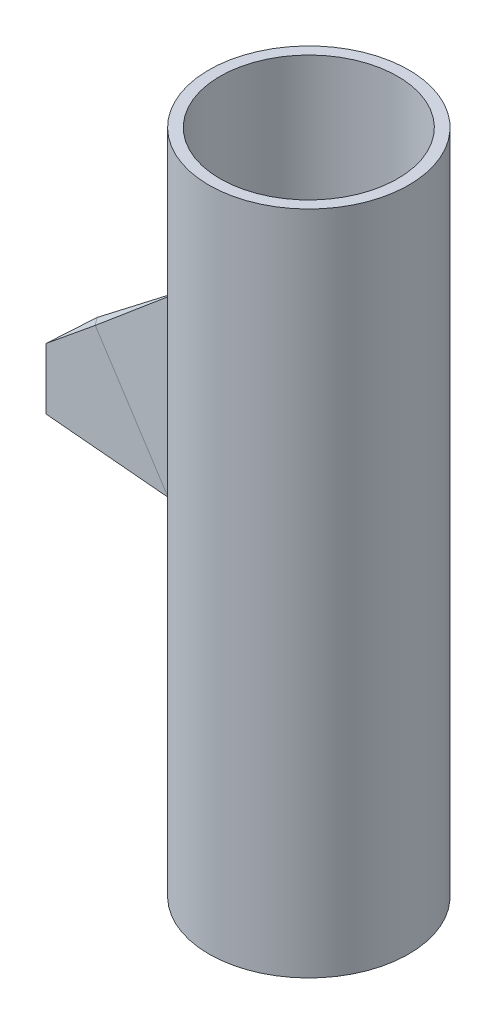
ISO-10303-21;
HEADER;
FILE_DESCRIPTION(('STEP AP214'),'2;1');
FILE_NAME('part.step','',(''),(''),'','','');
FILE_SCHEMA(('AUTOMOTIVE_DESIGN { 1 0 10303 214 1 1 1 1 }'));
ENDSEC;
DATA;
#1=APPLICATION_CONTEXT('core data for automotive mechanical design processes');
#2=APPLICATION_PROTOCOL_DEFINITION('international standard','automotive_design',2000,#1);
#3=PRODUCT_CONTEXT('',#1,'mechanical');
#4=PRODUCT('Part','Part','',(#3));
#5=PRODUCT_RELATED_PRODUCT_CATEGORY('part','',(#4));
#6=PRODUCT_DEFINITION_FORMATION('','',#4);
#7=PRODUCT_DEFINITION_CONTEXT('part definition',#1,'design');
#8=PRODUCT_DEFINITION('design','',#6,#7);
#9=PRODUCT_DEFINITION_SHAPE('','',#8);
#10=(LENGTH_UNIT() NAMED_UNIT(*) SI_UNIT(.MILLI.,.METRE.));
#11=(NAMED_UNIT(*) PLANE_ANGLE_UNIT() SI_UNIT($,.RADIAN.));
#12=(NAMED_UNIT(*) SI_UNIT($,.STERADIAN.) SOLID_ANGLE_UNIT());
#13=UNCERTAINTY_MEASURE_WITH_UNIT(LENGTH_MEASURE(1.E-05),#10,'distance_accuracy_value','');
#14=(GEOMETRIC_REPRESENTATION_CONTEXT(3) GLOBAL_UNCERTAINTY_ASSIGNED_CONTEXT((#13)) GLOBAL_UNIT_ASSIGNED_CONTEXT((#10,
#11,#12)) REPRESENTATION_CONTEXT('',''));
#15=CARTESIAN_POINT('',(0.,0.,0.));
#16=DIRECTION('',(0.,0.,1.));
#17=DIRECTION('',(1.,0.,0.));
#18=AXIS2_PLACEMENT_3D('',#15,#16,#17);
#19=CARTESIAN_POINT('',(-118.389869673722,159.01017756827,5.));
#20=DIRECTION('',(0.64018439966448,-0.768221279597376,0.));
#21=DIRECTION('',(0.768221279597376,0.64018439966448,0.));
#22=AXIS2_PLACEMENT_3D('',#19,#20,#21);
#23=PLANE('',#22);
#24=DIRECTION('',(0.767607085732421,0.639672571443684,-0.0399795357152303));
#25=VECTOR('',#24,1.);
#26=CARTESIAN_POINT('',(-58.4484196318922,208.961385936461,-1.90482530579749));
#27=LINE('',#26,#25);
#28=CARTESIAN_POINT('',(-95.3693632338271,178.193932934849,0.0181405068032898));
#29=VERTEX_POINT('',#28);
#30=CARTESIAN_POINT('',(-95.0210655032028,178.484181043703,0.));
#31=VERTEX_POINT('',#30);
#32=EDGE_CURVE('E171',#29,#31,#27,.T.);
#33=ORIENTED_EDGE('',*,*,#32,.T.);
#34=DIRECTION('',(-0.767607085732421,-0.639672571443684,-0.0399795357152303));
#35=VECTOR('',#34,1.);
#36=CARTESIAN_POINT('',(-95.3714965549691,178.192155167231,-0.0182516172794495));
#37=LINE('',#36,#35);
#38=CARTESIAN_POINT('',(-95.3693632338269,178.193932934849,-0.0181405068032945));
#39=VERTEX_POINT('',#38);
#40=EDGE_CURVE('E174',#31,#39,#37,.T.);
#41=ORIENTED_EDGE('',*,*,#40,.T.);
#42=DIRECTION('',(-0.766651877999928,-0.63887656499994,0.063887656499994));
#43=VECTOR('',#42,1.);
#44=CARTESIAN_POINT('',(-118.296796937566,159.087738181733,1.8924789685083));
#45=LINE('',#44,#43);
#46=CARTESIAN_POINT('',(-95.5870493154665,178.012527866816,0.));
#47=VERTEX_POINT('',#46);
#48=EDGE_CURVE('E161',#39,#47,#45,.T.);
#49=ORIENTED_EDGE('',*,*,#48,.T.);
#50=DIRECTION('',(0.766651877999928,0.63887656499994,0.063887656499994));
#51=VECTOR('',#50,1.);
#52=CARTESIAN_POINT('',(-95.2198738606429,178.318507412503,0.0305979545686391));
#53=LINE('',#52,#51);
#54=EDGE_CURVE('E165',#47,#29,#53,.T.);
#55=ORIENTED_EDGE('',*,*,#54,.T.);
#56=EDGE_LOOP('',(#33,#41,#49,#55));
#57=FACE_BOUND('',#56,.T.);
#58=ADVANCED_FACE('F60',(#57),#23,.F.);
#59=CARTESIAN_POINT('',(-58.3898696737222,129.01017756827,5.));
#60=DIRECTION('',(0.,1.,0.));
#61=DIRECTION('',(0.,0.,1.));
#62=AXIS2_PLACEMENT_3D('',#59,#60,#61);
#63=PLANE('',#62);
#64=DIRECTION('',(0.99654575824488,0.,-0.08304547985374));
#65=VECTOR('',#64,1.);
#66=CARTESIAN_POINT('',(-118.389869673722,129.01017756827,0.));
#67=LINE('',#66,#65);
#68=CARTESIAN_POINT('',(-118.389869673722,129.01017756827,0.));
#69=VERTEX_POINT('',#68);
#70=CARTESIAN_POINT('',(-58.3898696737222,129.01017756827,-5.));
#71=VERTEX_POINT('',#70);
#72=EDGE_CURVE('E130',#69,#71,#67,.T.);
#73=ORIENTED_EDGE('',*,*,#72,.T.);
#74=DIRECTION('',(0.,0.,-1.));
#75=VECTOR('',#74,1.);
#76=CARTESIAN_POINT('',(-58.3898696737222,129.01017756827,5.));
#77=LINE('',#76,#75);
#78=CARTESIAN_POINT('',(-58.3898696737222,129.01017756827,5.));
#79=VERTEX_POINT('',#78);
#80=EDGE_CURVE('E146',#79,#71,#77,.T.);
#81=ORIENTED_EDGE('',*,*,#80,.F.);
#82=DIRECTION('',(-0.99654575824488,0.,-0.08304547985374));
#83=VECTOR('',#82,1.);
#84=CARTESIAN_POINT('',(-58.3898696737222,129.01017756827,5.));
#85=LINE('',#84,#83);
#86=EDGE_CURVE('E139',#79,#69,#85,.T.);
#87=ORIENTED_EDGE('',*,*,#86,.T.);
#88=EDGE_LOOP('',(#73,#81,#87));
#89=FACE_BOUND('',#88,.T.);
#90=ADVANCED_FACE('F144',(#89),#63,.F.);
#91=CARTESIAN_POINT('',(-58.3898696737222,209.01017756827,5.));
#92=DIRECTION('',(-1.,0.,0.));
#93=DIRECTION('',(0.,-1.,0.));
#94=AXIS2_PLACEMENT_3D('',#91,#92,#93);
#95=PLANE('',#94);
#96=CARTESIAN_POINT('',(-58.3898696737222,162.229328701854,0.));
#97=DIRECTION('',(1.,0.,0.));
#98=DIRECTION('',(0.,1.,0.));
#99=AXIS2_PLACEMENT_3D('',#96,#97,#98);
#100=CIRCLE('',#99,2.);
#101=CARTESIAN_POINT('',(-58.3898696737222,164.229328701854,0.));
#102=VERTEX_POINT('',#101);
#103=EDGE_CURVE('E217',#102,#102,#100,.T.);
#104=ORIENTED_EDGE('',*,*,#103,.F.);
#105=EDGE_LOOP('',(#104));
#106=FACE_BOUND('',#105,.T.);
#107=DIRECTION('',(0.,0.998052578482889,0.0623782861551805));
#108=VECTOR('',#107,1.);
#109=CARTESIAN_POINT('',(-58.3898696737222,209.01017756827,0.));
#110=LINE('',#109,#108);
#111=CARTESIAN_POINT('',(-58.3898696737222,206.531517581945,-0.154916249145324));
#112=VERTEX_POINT('',#111);
#113=EDGE_CURVE('E152',#71,#112,#110,.T.);
#114=ORIENTED_EDGE('',*,*,#113,.T.);
#115=DIRECTION('',(0.,0.768641882328392,0.639679338989987));
#116=VECTOR('',#115,1.);
#117=CARTESIAN_POINT('',(-58.3898696737222,178.031969088937,-23.8728176030186));
#118=LINE('',#117,#116);
#119=CARTESIAN_POINT('',(-58.3898696737222,206.717665719126,0.));
#120=VERTEX_POINT('',#119);
#121=EDGE_CURVE('E188',#112,#120,#118,.T.);
#122=ORIENTED_EDGE('',*,*,#121,.T.);
#123=DIRECTION('',(0.,-0.76864188232839,0.639679338989989));
#124=VECTOR('',#123,1.);
#125=CARTESIAN_POINT('',(-58.3898696737222,177.873017458231,24.0051003687634));
#126=LINE('',#125,#124);
#127=CARTESIAN_POINT('',(-58.3898696737222,206.531517581945,0.154916249145326));
#128=VERTEX_POINT('',#127);
#129=EDGE_CURVE('E185',#120,#128,#126,.T.);
#130=ORIENTED_EDGE('',*,*,#129,.T.);
#131=DIRECTION('',(0.,-0.998052578482889,0.0623782861551805));
#132=VECTOR('',#131,1.);
#133=CARTESIAN_POINT('',(-58.3898696737222,129.01017756827,5.));
#134=LINE('',#133,#132);
#135=EDGE_CURVE('E157',#128,#79,#134,.T.);
#136=ORIENTED_EDGE('',*,*,#135,.T.);
#137=ORIENTED_EDGE('',*,*,#80,.T.);
#138=EDGE_LOOP('',(#114,#122,#130,#136,#137));
#139=FACE_BOUND('',#138,.T.);
#140=ADVANCED_FACE('F159',(#106,#139),#95,.F.);
#141=CARTESIAN_POINT('',(-118.390869673722,209.01017756827,0.));
#142=DIRECTION('',(0.,0.0623782861551805,-0.998052578482889));
#143=DIRECTION('',(0.,0.998052578482889,0.0623782861551805));
#144=AXIS2_PLACEMENT_3D('',#141,#142,#143);
#145=PLANE('',#144);
#146=DIRECTION('',(0.599251403326707,-0.799001871102276,-0.0499376169438922));
#147=VECTOR('',#146,1.);
#148=CARTESIAN_POINT('',(-161.956547745772,267.099081664337,3.63055650600419));
#149=LINE('',#148,#147);
#150=CARTESIAN_POINT('',(-94.1689496800336,176.715617576685,-2.01840999947405));
#151=VERTEX_POINT('',#150);
#152=EDGE_CURVE('E126',#151,#71,#149,.T.);
#153=ORIENTED_EDGE('',*,*,#152,.F.);
#154=DIRECTION('',(0.767607085732421,0.639672571443684,0.0399795357152303));
#155=VECTOR('',#154,1.);
#156=CARTESIAN_POINT('',(-57.1680508325632,207.549699949577,-0.0912798511682949));
#157=LINE('',#156,#155);
#158=EDGE_CURVE('E154',#151,#112,#157,.T.);
#159=ORIENTED_EDGE('',*,*,#158,.T.);
#160=ORIENTED_EDGE('',*,*,#113,.F.);
#161=EDGE_LOOP('',(#153,#159,#160));
#162=FACE_BOUND('',#161,.T.);
#163=ADVANCED_FACE('F153',(#162),#145,.T.);
#164=CARTESIAN_POINT('',(-118.390869673722,129.01017756827,5.));
#165=DIRECTION('',(0.,0.0623782861551805,0.998052578482889));
#166=DIRECTION('',(0.,-0.998052578482889,0.0623782861551805));
#167=AXIS2_PLACEMENT_3D('',#164,#165,#166);
#168=PLANE('',#167);
#169=ORIENTED_EDGE('',*,*,#135,.F.);
#170=DIRECTION('',(-0.767607085732421,-0.639672571443684,0.0399795357152303));
#171=VECTOR('',#170,1.);
#172=CARTESIAN_POINT('',(-94.0911277556401,176.780469180346,2.01435677424522));
#173=LINE('',#172,#171);
#174=CARTESIAN_POINT('',(-94.1689496800336,176.715617576685,2.01840999947405));
#175=VERTEX_POINT('',#174);
#176=EDGE_CURVE('E85',#128,#175,#173,.T.);
#177=ORIENTED_EDGE('',*,*,#176,.T.);
#178=DIRECTION('',(-0.599251403326707,0.799001871102276,-0.0499376169438922));
#179=VECTOR('',#178,1.);
#180=CARTESIAN_POINT('',(-140.260787147269,238.171400866332,-1.82257645612888));
#181=LINE('',#180,#179);
#182=EDGE_CURVE('E140',#79,#175,#181,.T.);
#183=ORIENTED_EDGE('',*,*,#182,.F.);
#184=EDGE_LOOP('',(#169,#177,#183));
#185=FACE_BOUND('',#184,.T.);
#186=ADVANCED_FACE('F268',(#185),#168,.T.);
#187=CARTESIAN_POINT('',(-118.389869673722,300.001,0.));
#188=DIRECTION('',(-0.08304547985374,0.,-0.99654575824488));
#189=DIRECTION('',(-0.99654575824488,0.,0.08304547985374));
#190=AXIS2_PLACEMENT_3D('',#187,#188,#189);
#191=PLANE('',#190);
#192=DIRECTION('',(0.766651877999928,0.63887656499994,-0.063887656499994));
#193=VECTOR('',#192,1.);
#194=CARTESIAN_POINT('',(-94.1055960210215,176.782064853308,-2.02368947105839));
#195=LINE('',#194,#193);
#196=CARTESIAN_POINT('',(-118.389869673722,156.545170142724,0.));
#197=VERTEX_POINT('',#196);
#198=CARTESIAN_POINT('',(-94.252853218763,176.659350521856,-2.01141803791326));
#199=VERTEX_POINT('',#198);
#200=EDGE_CURVE('E178',#197,#199,#195,.T.);
#201=ORIENTED_EDGE('',*,*,#200,.T.);
#202=DIRECTION('',(0.828551245129587,0.555639714891766,-0.0690459370941323));
#203=VECTOR('',#202,1.);
#204=CARTESIAN_POINT('',(-54.154383545227,203.550025525929,-5.3529571773746));
#205=LINE('',#204,#203);
#206=EDGE_CURVE('E133',#199,#151,#205,.T.);
#207=ORIENTED_EDGE('',*,*,#206,.T.);
#208=ORIENTED_EDGE('',*,*,#152,.T.);
#209=ORIENTED_EDGE('',*,*,#72,.F.);
#210=DIRECTION('',(0.,-1.,0.));
#211=VECTOR('',#210,1.);
#212=CARTESIAN_POINT('',(-118.389869673722,300.001,0.));
#213=LINE('',#212,#211);
#214=EDGE_CURVE('E149',#197,#69,#213,.T.);
#215=ORIENTED_EDGE('',*,*,#214,.F.);
#216=EDGE_LOOP('',(#201,#207,#208,#209,#215));
#217=FACE_BOUND('',#216,.T.);
#218=ADVANCED_FACE('F128',(#217),#191,.T.);
#219=CARTESIAN_POINT('',(-58.3898696737222,300.001,5.));
#220=DIRECTION('',(-0.08304547985374,0.,0.99654575824488));
#221=DIRECTION('',(0.99654575824488,0.,0.08304547985374));
#222=AXIS2_PLACEMENT_3D('',#219,#220,#221);
#223=PLANE('',#222);
#224=ORIENTED_EDGE('',*,*,#182,.T.);
#225=DIRECTION('',(-0.828551245129587,-0.555639714891767,-0.0690459370941323));
#226=VECTOR('',#225,1.);
#227=CARTESIAN_POINT('',(-12.6785131111272,231.364407506958,8.80927971354958));
#228=LINE('',#227,#226);
#229=CARTESIAN_POINT('',(-94.252853218763,176.659350521856,2.01141803791326));
#230=VERTEX_POINT('',#229);
#231=EDGE_CURVE('E14',#175,#230,#228,.T.);
#232=ORIENTED_EDGE('',*,*,#231,.T.);
#233=DIRECTION('',(-0.766651877999928,-0.63887656499994,-0.063887656499994));
#234=VECTOR('',#233,1.);
#235=CARTESIAN_POINT('',(-117.182519097945,157.551295622539,0.100612547981467));
#236=LINE('',#235,#234);
#237=EDGE_CURVE('E71',#230,#197,#236,.T.);
#238=ORIENTED_EDGE('',*,*,#237,.T.);
#239=ORIENTED_EDGE('',*,*,#214,.T.);
#240=ORIENTED_EDGE('',*,*,#86,.F.);
#241=EDGE_LOOP('',(#224,#232,#238,#239,#240));
#242=FACE_BOUND('',#241,.T.);
#243=ADVANCED_FACE('F223',(#242),#223,.T.);
#244=CARTESIAN_POINT('',(-118.051898978382,159.291819814386,-1.87207080524299));
#245=DIRECTION('',(-0.49832568573028,0.529326023149063,0.686647997272725));
#246=DIRECTION('',(-0.766651877999928,-0.63887656499994,-0.063887656499994));
#247=AXIS2_PLACEMENT_3D('',#244,#245,#246);
#248=PLANE('',#247);
#249=DIRECTION('',(0.728106286505149,0.685464248193647,0.));
#250=VECTOR('',#249,1.);
#251=CARTESIAN_POINT('',(-117.30324099239,157.56815967862,0.));
#252=LINE('',#251,#250);
#253=EDGE_CURVE('E202',#197,#47,#252,.T.);
#254=ORIENTED_EDGE('',*,*,#253,.F.);
#255=ORIENTED_EDGE('',*,*,#237,.F.);
#256=DIRECTION('',(-0.405676734755801,0.55758065231573,-0.724244574050118));
#257=VECTOR('',#256,1.);
#258=CARTESIAN_POINT('',(-95.3820608180749,178.211385075189,-0.00452817421066039));
#259=LINE('',#258,#257);
#260=EDGE_CURVE('E65',#29,#230,#259,.F.);
#261=ORIENTED_EDGE('',*,*,#260,.F.);
#262=ORIENTED_EDGE('',*,*,#54,.F.);
#263=EDGE_LOOP('',(#254,#255,#261,#262));
#264=FACE_BOUND('',#263,.T.);
#265=ADVANCED_FACE('F63',(#264),#248,.T.);
#266=CARTESIAN_POINT('',(-118.505960709828,158.913435038181,1.22317162534503));
#267=DIRECTION('',(-0.442207349929334,0.573736618724845,0.689404780954308));
#268=DIRECTION('',(-0.767607085732421,-0.639672571443684,0.0399795357152302));
#269=AXIS2_PLACEMENT_3D('',#266,#267,#268);
#270=PLANE('',#269);
#271=ORIENTED_EDGE('',*,*,#176,.F.);
#272=ORIENTED_EDGE('',*,*,#129,.F.);
#273=DIRECTION('',(-0.792042210114094,-0.610466327816351,0.));
#274=VECTOR('',#273,1.);
#275=CARTESIAN_POINT('',(-119.216616273136,159.835466569397,0.));
#276=LINE('',#275,#274);
#277=EDGE_CURVE('E198',#31,#120,#276,.F.);
#278=ORIENTED_EDGE('',*,*,#277,.F.);
#279=ORIENTED_EDGE('',*,*,#32,.F.);
#280=ORIENTED_EDGE('',*,*,#260,.T.);
#281=ORIENTED_EDGE('',*,*,#231,.F.);
#282=EDGE_LOOP('',(#271,#272,#278,#279,#280,#281));
#283=FACE_BOUND('',#282,.T.);
#284=ADVANCED_FACE('F233',(#283),#270,.T.);
#285=CARTESIAN_POINT('',(-118.54169489675,158.88365654908,1.9128871317736));
#286=DIRECTION('',(-0.498325685730282,0.529326023149066,-0.686647997272721));
#287=DIRECTION('',(0.766651877999928,0.63887656499994,-0.063887656499994));
#288=AXIS2_PLACEMENT_3D('',#285,#286,#287);
#289=PLANE('',#288);
#290=ORIENTED_EDGE('',*,*,#253,.T.);
#291=ORIENTED_EDGE('',*,*,#48,.F.);
#292=DIRECTION('',(0.4056767347557,-0.557580652315809,-0.724244574050114));
#293=VECTOR('',#292,1.);
#294=CARTESIAN_POINT('',(-95.3823350036847,178.211761928428,0.00501767095370336));
#295=LINE('',#294,#293);
#296=EDGE_CURVE('E195',#199,#39,#295,.F.);
#297=ORIENTED_EDGE('',*,*,#296,.F.);
#298=ORIENTED_EDGE('',*,*,#200,.F.);
#299=EDGE_LOOP('',(#290,#291,#297,#298));
#300=FACE_BOUND('',#299,.T.);
#301=ADVANCED_FACE('F227',(#300),#289,.T.);
#302=CARTESIAN_POINT('',(-118.199074960835,159.169173162342,-1.20718799258498));
#303=DIRECTION('',(-0.442207349929332,0.573736618724843,-0.689404780954311));
#304=DIRECTION('',(0.767607085732421,0.639672571443684,0.0399795357152302));
#305=AXIS2_PLACEMENT_3D('',#302,#303,#304);
#306=PLANE('',#305);
#307=ORIENTED_EDGE('',*,*,#121,.F.);
#308=ORIENTED_EDGE('',*,*,#158,.F.);
#309=ORIENTED_EDGE('',*,*,#206,.F.);
#310=ORIENTED_EDGE('',*,*,#296,.T.);
#311=ORIENTED_EDGE('',*,*,#40,.F.);
#312=ORIENTED_EDGE('',*,*,#277,.T.);
#313=EDGE_LOOP('',(#307,#308,#309,#310,#311,#312));
#314=FACE_BOUND('',#313,.T.);
#315=ADVANCED_FACE('F230',(#314),#306,.T.);
#316=CARTESIAN_POINT('',(-68.3898696737222,162.229328701854,0.));
#317=DIRECTION('',(1.,0.,0.));
#318=DIRECTION('',(0.,1.,0.));
#319=AXIS2_PLACEMENT_3D('',#316,#317,#318);
#320=CYLINDRICAL_SURFACE('',#319,2.);
#321=CARTESIAN_POINT('',(-68.3898696737222,162.229328701854,0.));
#322=DIRECTION('',(1.,0.,0.));
#323=DIRECTION('',(0.,1.,0.));
#324=AXIS2_PLACEMENT_3D('',#321,#322,#323);
#325=CIRCLE('',#324,2.);
#326=CARTESIAN_POINT('',(-68.3898696737222,164.229328701854,0.));
#327=VERTEX_POINT('',#326);
#328=EDGE_CURVE('E199',#327,#327,#325,.T.);
#329=ORIENTED_EDGE('',*,*,#328,.F.);
#330=EDGE_LOOP('',(#329));
#331=FACE_BOUND('',#330,.T.);
#332=ORIENTED_EDGE('',*,*,#103,.T.);
#333=EDGE_LOOP('',(#332));
#334=FACE_BOUND('',#333,.T.);
#335=ADVANCED_FACE('F250',(#331,#334),#320,.F.);
#336=CARTESIAN_POINT('',(-68.3898696737222,162.229328701854,0.));
#337=DIRECTION('',(1.,0.,0.));
#338=DIRECTION('',(0.,1.,0.));
#339=AXIS2_PLACEMENT_3D('',#336,#337,#338);
#340=PLANE('',#339);
#341=ORIENTED_EDGE('',*,*,#328,.T.);
#342=EDGE_LOOP('',(#341));
#343=FACE_BOUND('',#342,.T.);
#344=ADVANCED_FACE('F287',(#343),#340,.T.);
#345=CLOSED_SHELL('',(#58,#90,#140,#163,#186,#218,#243,#265,#284,#301,#315,#335,#344));
#346=MANIFOLD_SOLID_BREP('B2',#345);
#347=CARTESIAN_POINT('',(0.,300.,0.));
#348=DIRECTION('',(0.,1.,0.));
#349=DIRECTION('',(0.,0.,1.));
#350=AXIS2_PLACEMENT_3D('',#347,#348,#349);
#351=PLANE('',#350);
#352=CARTESIAN_POINT('',(0.,300.,0.));
#353=DIRECTION('',(0.,1.,0.));
#354=DIRECTION('',(0.,0.,1.));
#355=AXIS2_PLACEMENT_3D('',#352,#353,#354);
#356=CIRCLE('',#355,45.);
#357=CARTESIAN_POINT('',(0.,300.,45.));
#358=VERTEX_POINT('',#357);
#359=EDGE_CURVE('E59',#358,#358,#356,.T.);
#360=ORIENTED_EDGE('',*,*,#359,.T.);
#361=EDGE_LOOP('',(#360));
#362=FACE_BOUND('',#361,.T.);
#363=CARTESIAN_POINT('',(0.,300.,0.));
#364=DIRECTION('',(0.,1.,0.));
#365=DIRECTION('',(0.,0.,1.));
#366=AXIS2_PLACEMENT_3D('',#363,#364,#365);
#367=CIRCLE('',#366,40.);
#368=CARTESIAN_POINT('',(0.,300.,40.));
#369=VERTEX_POINT('',#368);
#370=EDGE_CURVE('E374',#369,#369,#367,.T.);
#371=ORIENTED_EDGE('',*,*,#370,.F.);
#372=EDGE_LOOP('',(#371));
#373=FACE_BOUND('',#372,.T.);
#374=ADVANCED_FACE('F363',(#362,#373),#351,.T.);
#375=CARTESIAN_POINT('',(0.,0.,0.));
#376=DIRECTION('',(0.,1.,0.));
#377=DIRECTION('',(0.,0.,1.));
#378=AXIS2_PLACEMENT_3D('',#375,#376,#377);
#379=PLANE('',#378);
#380=CARTESIAN_POINT('',(0.,0.,0.));
#381=DIRECTION('',(0.,1.,0.));
#382=DIRECTION('',(0.,0.,1.));
#383=AXIS2_PLACEMENT_3D('',#380,#381,#382);
#384=CIRCLE('',#383,45.);
#385=CARTESIAN_POINT('',(0.,0.,45.));
#386=VERTEX_POINT('',#385);
#387=EDGE_CURVE('E367',#386,#386,#384,.T.);
#388=ORIENTED_EDGE('',*,*,#387,.F.);
#389=EDGE_LOOP('',(#388));
#390=FACE_BOUND('',#389,.T.);
#391=CARTESIAN_POINT('',(0.,0.,0.));
#392=DIRECTION('',(0.,1.,0.));
#393=DIRECTION('',(0.,0.,1.));
#394=AXIS2_PLACEMENT_3D('',#391,#392,#393);
#395=CIRCLE('',#394,40.);
#396=CARTESIAN_POINT('',(0.,0.,40.));
#397=VERTEX_POINT('',#396);
#398=EDGE_CURVE('E376',#397,#397,#395,.T.);
#399=ORIENTED_EDGE('',*,*,#398,.T.);
#400=EDGE_LOOP('',(#399));
#401=FACE_BOUND('',#400,.T.);
#402=ADVANCED_FACE('F386',(#390,#401),#379,.F.);
#403=CARTESIAN_POINT('',(0.,300.,0.));
#404=DIRECTION('',(0.,-1.,0.));
#405=DIRECTION('',(0.,0.,-1.));
#406=AXIS2_PLACEMENT_3D('',#403,#404,#405);
#407=CYLINDRICAL_SURFACE('',#406,45.);
#408=ORIENTED_EDGE('',*,*,#359,.F.);
#409=EDGE_LOOP('',(#408));
#410=FACE_BOUND('',#409,.T.);
#411=ORIENTED_EDGE('',*,*,#387,.T.);
#412=EDGE_LOOP('',(#411));
#413=FACE_BOUND('',#412,.T.);
#414=ADVANCED_FACE('F365',(#410,#413),#407,.T.);
#415=CARTESIAN_POINT('',(0.,300.,0.));
#416=DIRECTION('',(0.,-1.,0.));
#417=DIRECTION('',(0.,0.,-1.));
#418=AXIS2_PLACEMENT_3D('',#415,#416,#417);
#419=CYLINDRICAL_SURFACE('',#418,40.);
#420=ORIENTED_EDGE('',*,*,#370,.T.);
#421=EDGE_LOOP('',(#420));
#422=FACE_BOUND('',#421,.T.);
#423=ORIENTED_EDGE('',*,*,#398,.F.);
#424=EDGE_LOOP('',(#423));
#425=FACE_BOUND('',#424,.T.);
#426=ADVANCED_FACE('F382',(#422,#425),#419,.F.);
#427=CLOSED_SHELL('',(#374,#402,#414,#426));
#428=MANIFOLD_SOLID_BREP('B8_NOT_SHOWN',#427);
#429=ADVANCED_BREP_SHAPE_REPRESENTATION('',(#18,#346,#428),#14);
#430=SHAPE_DEFINITION_REPRESENTATION(#9,#429);
ENDSEC;
END-ISO-10303-21;
